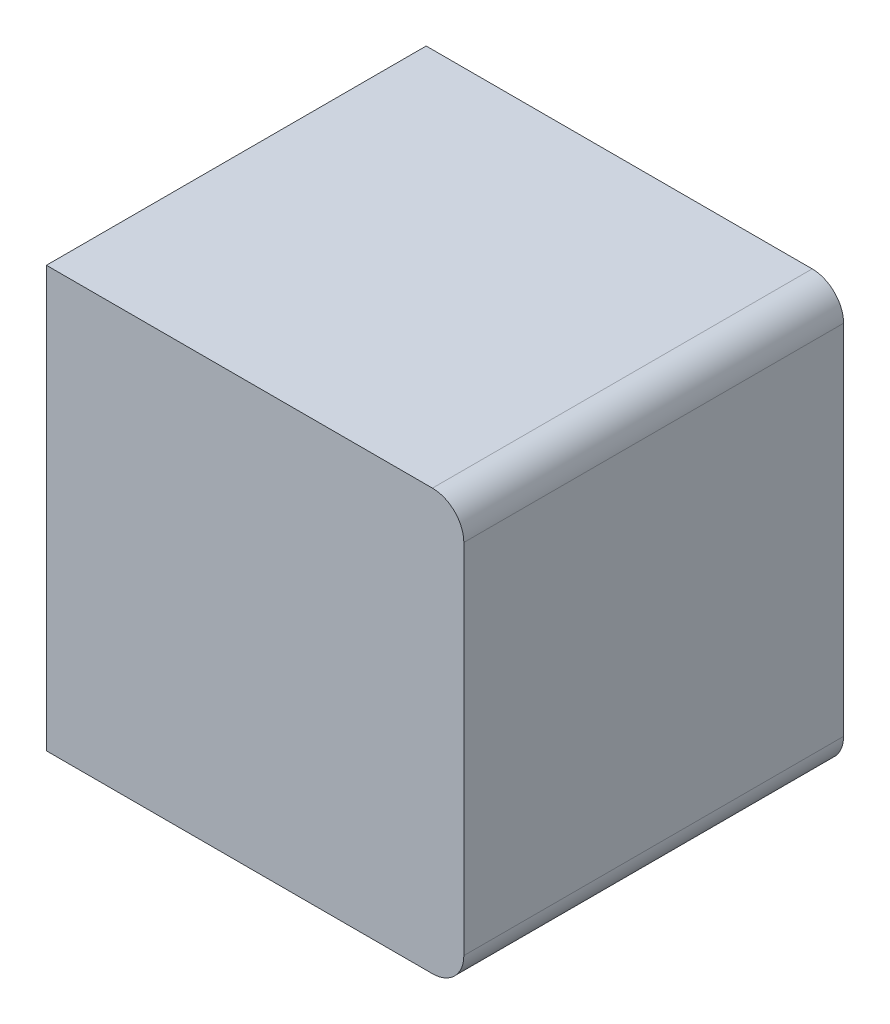
ISO-10303-21;
HEADER;
FILE_DESCRIPTION(('STEP AP214'),'2;1');
FILE_NAME('part.step','',(''),(''),'','','');
FILE_SCHEMA(('AUTOMOTIVE_DESIGN { 1 0 10303 214 1 1 1 1 }'));
ENDSEC;
DATA;
#1=APPLICATION_CONTEXT('core data for automotive mechanical design processes');
#2=APPLICATION_PROTOCOL_DEFINITION('international standard','automotive_design',2000,#1);
#3=PRODUCT_CONTEXT('',#1,'mechanical');
#4=PRODUCT('Part','Part','',(#3));
#5=PRODUCT_RELATED_PRODUCT_CATEGORY('part','',(#4));
#6=PRODUCT_DEFINITION_FORMATION('','',#4);
#7=PRODUCT_DEFINITION_CONTEXT('part definition',#1,'design');
#8=PRODUCT_DEFINITION('design','',#6,#7);
#9=PRODUCT_DEFINITION_SHAPE('','',#8);
#10=(LENGTH_UNIT() NAMED_UNIT(*) SI_UNIT(.MILLI.,.METRE.));
#11=(NAMED_UNIT(*) PLANE_ANGLE_UNIT() SI_UNIT($,.RADIAN.));
#12=(NAMED_UNIT(*) SI_UNIT($,.STERADIAN.) SOLID_ANGLE_UNIT());
#13=UNCERTAINTY_MEASURE_WITH_UNIT(LENGTH_MEASURE(1.E-05),#10,'distance_accuracy_value','');
#14=(GEOMETRIC_REPRESENTATION_CONTEXT(3) GLOBAL_UNCERTAINTY_ASSIGNED_CONTEXT((#13)) GLOBAL_UNIT_ASSIGNED_CONTEXT((#10,
#11,#12)) REPRESENTATION_CONTEXT('',''));
#15=CARTESIAN_POINT('',(0.,0.,0.));
#16=DIRECTION('',(0.,0.,1.));
#17=DIRECTION('',(1.,0.,0.));
#18=AXIS2_PLACEMENT_3D('',#15,#16,#17);
#19=CARTESIAN_POINT('',(23.25,24.3282051282051,-60.5));
#20=DIRECTION('',(0.,0.,1.));
#21=DIRECTION('',(1.,0.,0.));
#22=AXIS2_PLACEMENT_3D('',#19,#20,#21);
#23=CYLINDRICAL_SURFACE('',#22,5.00000000000001);
#24=CARTESIAN_POINT('',(23.25,24.3282051282051,0.));
#25=DIRECTION('',(0.,0.,1.));
#26=DIRECTION('',(1.,0.,0.));
#27=AXIS2_PLACEMENT_3D('',#24,#25,#26);
#28=CIRCLE('',#27,5.00000000000001);
#29=CARTESIAN_POINT('',(28.25,24.3282051282051,0.));
#30=VERTEX_POINT('',#29);
#31=CARTESIAN_POINT('',(23.2499999999999,29.3282051282051,0.));
#32=VERTEX_POINT('',#31);
#33=EDGE_CURVE('E118',#30,#32,#28,.T.);
#34=ORIENTED_EDGE('',*,*,#33,.F.);
#35=DIRECTION('',(0.,0.,1.));
#36=VECTOR('',#35,1.);
#37=CARTESIAN_POINT('',(28.25,24.3282051282051,-60.5));
#38=LINE('',#37,#36);
#39=CARTESIAN_POINT('',(28.25,24.3282051282051,-60.5));
#40=VERTEX_POINT('',#39);
#41=EDGE_CURVE('E11',#40,#30,#38,.T.);
#42=ORIENTED_EDGE('',*,*,#41,.F.);
#43=CARTESIAN_POINT('',(23.25,24.3282051282051,-60.5));
#44=DIRECTION('',(0.,0.,1.));
#45=DIRECTION('',(1.,0.,0.));
#46=AXIS2_PLACEMENT_3D('',#43,#44,#45);
#47=CIRCLE('',#46,5.00000000000001);
#48=CARTESIAN_POINT('',(23.2499999999999,29.3282051282051,-60.5));
#49=VERTEX_POINT('',#48);
#50=EDGE_CURVE('E131',#40,#49,#47,.T.);
#51=ORIENTED_EDGE('',*,*,#50,.T.);
#52=DIRECTION('',(0.,0.,1.));
#53=VECTOR('',#52,1.);
#54=CARTESIAN_POINT('',(23.2499999999999,29.3282051282051,-60.5));
#55=LINE('',#54,#53);
#56=EDGE_CURVE('E37',#49,#32,#55,.T.);
#57=ORIENTED_EDGE('',*,*,#56,.T.);
#58=EDGE_LOOP('',(#34,#42,#51,#57));
#59=FACE_BOUND('',#58,.T.);
#60=ADVANCED_FACE('F34',(#59),#23,.T.);
#61=CARTESIAN_POINT('',(28.25,24.3282051282051,-60.5));
#62=DIRECTION('',(-1.,0.,0.));
#63=DIRECTION('',(0.,-1.,0.));
#64=AXIS2_PLACEMENT_3D('',#61,#62,#63);
#65=PLANE('',#64);
#66=DIRECTION('',(0.,-1.,0.));
#67=VECTOR('',#66,1.);
#68=CARTESIAN_POINT('',(28.25,24.3282051282051,0.));
#69=LINE('',#68,#67);
#70=CARTESIAN_POINT('',(28.25,-32.6717948717949,0.));
#71=VERTEX_POINT('',#70);
#72=EDGE_CURVE('E130',#30,#71,#69,.T.);
#73=ORIENTED_EDGE('',*,*,#72,.T.);
#74=DIRECTION('',(0.,0.,1.));
#75=VECTOR('',#74,1.);
#76=CARTESIAN_POINT('',(28.25,-32.6717948717949,-60.5));
#77=LINE('',#76,#75);
#78=CARTESIAN_POINT('',(28.25,-32.6717948717949,-60.5));
#79=VERTEX_POINT('',#78);
#80=EDGE_CURVE('E43',#79,#71,#77,.T.);
#81=ORIENTED_EDGE('',*,*,#80,.F.);
#82=DIRECTION('',(0.,-1.,0.));
#83=VECTOR('',#82,1.);
#84=CARTESIAN_POINT('',(28.25,24.3282051282051,-60.5));
#85=LINE('',#84,#83);
#86=EDGE_CURVE('E109',#40,#79,#85,.T.);
#87=ORIENTED_EDGE('',*,*,#86,.F.);
#88=ORIENTED_EDGE('',*,*,#41,.T.);
#89=EDGE_LOOP('',(#73,#81,#87,#88));
#90=FACE_BOUND('',#89,.T.);
#91=ADVANCED_FACE('F141',(#90),#65,.F.);
#92=CARTESIAN_POINT('',(23.25,-32.6717948717949,-60.5));
#93=DIRECTION('',(0.,0.,1.));
#94=DIRECTION('',(1.,0.,0.));
#95=AXIS2_PLACEMENT_3D('',#92,#93,#94);
#96=CYLINDRICAL_SURFACE('',#95,5.);
#97=CARTESIAN_POINT('',(23.25,-32.6717948717949,0.));
#98=DIRECTION('',(0.,0.,1.));
#99=DIRECTION('',(1.,0.,0.));
#100=AXIS2_PLACEMENT_3D('',#97,#98,#99);
#101=CIRCLE('',#100,5.);
#102=CARTESIAN_POINT('',(23.2499999999999,-37.6717948717949,0.));
#103=VERTEX_POINT('',#102);
#104=EDGE_CURVE('E98',#103,#71,#101,.T.);
#105=ORIENTED_EDGE('',*,*,#104,.F.);
#106=DIRECTION('',(0.,0.,1.));
#107=VECTOR('',#106,1.);
#108=CARTESIAN_POINT('',(23.2499999999999,-37.6717948717949,-60.5));
#109=LINE('',#108,#107);
#110=CARTESIAN_POINT('',(23.2499999999999,-37.6717948717949,-60.5));
#111=VERTEX_POINT('',#110);
#112=EDGE_CURVE('E93',#111,#103,#109,.T.);
#113=ORIENTED_EDGE('',*,*,#112,.F.);
#114=CARTESIAN_POINT('',(23.25,-32.6717948717949,-60.5));
#115=DIRECTION('',(0.,0.,1.));
#116=DIRECTION('',(1.,0.,0.));
#117=AXIS2_PLACEMENT_3D('',#114,#115,#116);
#118=CIRCLE('',#117,5.);
#119=EDGE_CURVE('E96',#111,#79,#118,.T.);
#120=ORIENTED_EDGE('',*,*,#119,.T.);
#121=ORIENTED_EDGE('',*,*,#80,.T.);
#122=EDGE_LOOP('',(#105,#113,#120,#121));
#123=FACE_BOUND('',#122,.T.);
#124=ADVANCED_FACE('F95',(#123),#96,.T.);
#125=CARTESIAN_POINT('',(-38.25,-37.6717948717949,-60.5));
#126=DIRECTION('',(0.,-1.,0.));
#127=DIRECTION('',(1.,0.,0.));
#128=AXIS2_PLACEMENT_3D('',#125,#126,#127);
#129=PLANE('',#128);
#130=DIRECTION('',(1.,0.,0.));
#131=VECTOR('',#130,1.);
#132=CARTESIAN_POINT('',(-38.25,-37.6717948717949,0.));
#133=LINE('',#132,#131);
#134=CARTESIAN_POINT('',(-38.25,-37.6717948717949,0.));
#135=VERTEX_POINT('',#134);
#136=EDGE_CURVE('E127',#135,#103,#133,.T.);
#137=ORIENTED_EDGE('',*,*,#136,.F.);
#138=DIRECTION('',(0.,0.,1.));
#139=VECTOR('',#138,1.);
#140=CARTESIAN_POINT('',(-38.25,-37.6717948717949,-60.5));
#141=LINE('',#140,#139);
#142=CARTESIAN_POINT('',(-38.25,-37.6717948717949,-60.5));
#143=VERTEX_POINT('',#142);
#144=EDGE_CURVE('E103',#143,#135,#141,.T.);
#145=ORIENTED_EDGE('',*,*,#144,.F.);
#146=DIRECTION('',(1.,0.,0.));
#147=VECTOR('',#146,1.);
#148=CARTESIAN_POINT('',(-38.25,-37.6717948717949,-60.5));
#149=LINE('',#148,#147);
#150=EDGE_CURVE('E107',#143,#111,#149,.T.);
#151=ORIENTED_EDGE('',*,*,#150,.T.);
#152=ORIENTED_EDGE('',*,*,#112,.T.);
#153=EDGE_LOOP('',(#137,#145,#151,#152));
#154=FACE_BOUND('',#153,.T.);
#155=ADVANCED_FACE('F111',(#154),#129,.T.);
#156=CARTESIAN_POINT('',(-38.25,29.3282051282051,-60.5));
#157=DIRECTION('',(-1.,0.,0.));
#158=DIRECTION('',(0.,-1.,0.));
#159=AXIS2_PLACEMENT_3D('',#156,#157,#158);
#160=PLANE('',#159);
#161=DIRECTION('',(0.,-1.,0.));
#162=VECTOR('',#161,1.);
#163=CARTESIAN_POINT('',(-38.25,29.3282051282051,0.));
#164=LINE('',#163,#162);
#165=CARTESIAN_POINT('',(-38.25,29.3282051282051,0.));
#166=VERTEX_POINT('',#165);
#167=EDGE_CURVE('E124',#166,#135,#164,.T.);
#168=ORIENTED_EDGE('',*,*,#167,.F.);
#169=DIRECTION('',(0.,0.,1.));
#170=VECTOR('',#169,1.);
#171=CARTESIAN_POINT('',(-38.25,29.3282051282051,-60.5));
#172=LINE('',#171,#170);
#173=CARTESIAN_POINT('',(-38.25,29.3282051282051,-60.5));
#174=VERTEX_POINT('',#173);
#175=EDGE_CURVE('E134',#174,#166,#172,.T.);
#176=ORIENTED_EDGE('',*,*,#175,.F.);
#177=DIRECTION('',(0.,-1.,0.));
#178=VECTOR('',#177,1.);
#179=CARTESIAN_POINT('',(-38.25,29.3282051282051,-60.5));
#180=LINE('',#179,#178);
#181=EDGE_CURVE('E112',#174,#143,#180,.T.);
#182=ORIENTED_EDGE('',*,*,#181,.T.);
#183=ORIENTED_EDGE('',*,*,#144,.T.);
#184=EDGE_LOOP('',(#168,#176,#182,#183));
#185=FACE_BOUND('',#184,.T.);
#186=ADVANCED_FACE('F155',(#185),#160,.T.);
#187=CARTESIAN_POINT('',(-38.25,29.3282051282051,-60.5));
#188=DIRECTION('',(0.,-1.,0.));
#189=DIRECTION('',(1.,0.,0.));
#190=AXIS2_PLACEMENT_3D('',#187,#188,#189);
#191=PLANE('',#190);
#192=DIRECTION('',(1.,0.,0.));
#193=VECTOR('',#192,1.);
#194=CARTESIAN_POINT('',(-38.25,29.3282051282051,0.));
#195=LINE('',#194,#193);
#196=EDGE_CURVE('E121',#166,#32,#195,.T.);
#197=ORIENTED_EDGE('',*,*,#196,.T.);
#198=ORIENTED_EDGE('',*,*,#56,.F.);
#199=DIRECTION('',(1.,0.,0.));
#200=VECTOR('',#199,1.);
#201=CARTESIAN_POINT('',(-38.25,29.3282051282051,-60.5));
#202=LINE('',#201,#200);
#203=EDGE_CURVE('E85',#174,#49,#202,.T.);
#204=ORIENTED_EDGE('',*,*,#203,.F.);
#205=ORIENTED_EDGE('',*,*,#175,.T.);
#206=EDGE_LOOP('',(#197,#198,#204,#205));
#207=FACE_BOUND('',#206,.T.);
#208=ADVANCED_FACE('F137',(#207),#191,.F.);
#209=CARTESIAN_POINT('',(23.25,24.3282051282051,-60.5));
#210=DIRECTION('',(0.,0.,1.));
#211=DIRECTION('',(1.,0.,0.));
#212=AXIS2_PLACEMENT_3D('',#209,#210,#211);
#213=PLANE('',#212);
#214=ORIENTED_EDGE('',*,*,#50,.F.);
#215=ORIENTED_EDGE('',*,*,#86,.T.);
#216=ORIENTED_EDGE('',*,*,#119,.F.);
#217=ORIENTED_EDGE('',*,*,#150,.F.);
#218=ORIENTED_EDGE('',*,*,#181,.F.);
#219=ORIENTED_EDGE('',*,*,#203,.T.);
#220=EDGE_LOOP('',(#214,#215,#216,#217,#218,#219));
#221=FACE_BOUND('',#220,.T.);
#222=ADVANCED_FACE('F106',(#221),#213,.F.);
#223=CARTESIAN_POINT('',(23.25,24.3282051282051,0.));
#224=DIRECTION('',(0.,0.,1.));
#225=DIRECTION('',(1.,0.,0.));
#226=AXIS2_PLACEMENT_3D('',#223,#224,#225);
#227=PLANE('',#226);
#228=ORIENTED_EDGE('',*,*,#33,.T.);
#229=ORIENTED_EDGE('',*,*,#196,.F.);
#230=ORIENTED_EDGE('',*,*,#167,.T.);
#231=ORIENTED_EDGE('',*,*,#136,.T.);
#232=ORIENTED_EDGE('',*,*,#104,.T.);
#233=ORIENTED_EDGE('',*,*,#72,.F.);
#234=EDGE_LOOP('',(#228,#229,#230,#231,#232,#233));
#235=FACE_BOUND('',#234,.T.);
#236=ADVANCED_FACE('F140',(#235),#227,.T.);
#237=CLOSED_SHELL('',(#60,#91,#124,#155,#186,#208,#222,#236));
#238=MANIFOLD_SOLID_BREP('B2',#237);
#239=ADVANCED_BREP_SHAPE_REPRESENTATION('',(#18,#238),#14);
#240=SHAPE_DEFINITION_REPRESENTATION(#9,#239);
ENDSEC;
END-ISO-10303-21;
